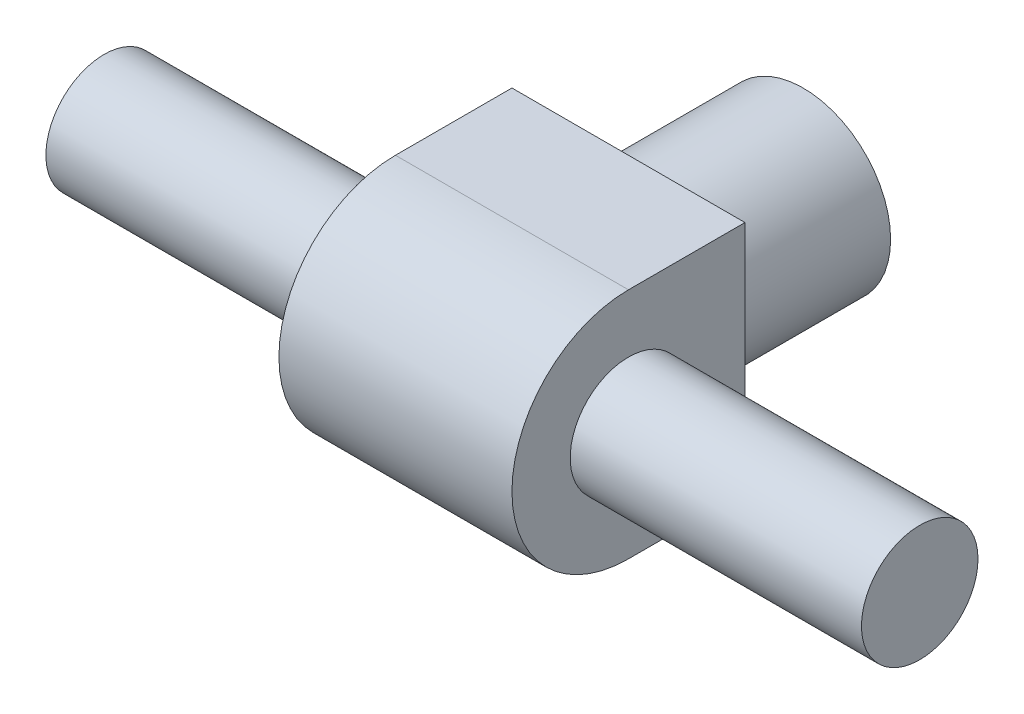
ISO-10303-21;
HEADER;
FILE_DESCRIPTION(('STEP AP214'),'2;1');
FILE_NAME('part.step','',(''),(''),'','','');
FILE_SCHEMA(('AUTOMOTIVE_DESIGN { 1 0 10303 214 1 1 1 1 }'));
ENDSEC;
DATA;
#1=APPLICATION_CONTEXT('core data for automotive mechanical design processes');
#2=APPLICATION_PROTOCOL_DEFINITION('international standard','automotive_design',2000,#1);
#3=PRODUCT_CONTEXT('',#1,'mechanical');
#4=PRODUCT('Part','Part','',(#3));
#5=PRODUCT_RELATED_PRODUCT_CATEGORY('part','',(#4));
#6=PRODUCT_DEFINITION_FORMATION('','',#4);
#7=PRODUCT_DEFINITION_CONTEXT('part definition',#1,'design');
#8=PRODUCT_DEFINITION('design','',#6,#7);
#9=PRODUCT_DEFINITION_SHAPE('','',#8);
#10=(LENGTH_UNIT() NAMED_UNIT(*) SI_UNIT(.MILLI.,.METRE.));
#11=(NAMED_UNIT(*) PLANE_ANGLE_UNIT() SI_UNIT($,.RADIAN.));
#12=(NAMED_UNIT(*) SI_UNIT($,.STERADIAN.) SOLID_ANGLE_UNIT());
#13=UNCERTAINTY_MEASURE_WITH_UNIT(LENGTH_MEASURE(1.E-05),#10,'distance_accuracy_value','');
#14=(GEOMETRIC_REPRESENTATION_CONTEXT(3) GLOBAL_UNCERTAINTY_ASSIGNED_CONTEXT((#13)) GLOBAL_UNIT_ASSIGNED_CONTEXT((#10,
#11,#12)) REPRESENTATION_CONTEXT('',''));
#15=CARTESIAN_POINT('',(0.,0.,0.));
#16=DIRECTION('',(0.,0.,1.));
#17=DIRECTION('',(1.,0.,0.));
#18=AXIS2_PLACEMENT_3D('',#15,#16,#17);
#19=CARTESIAN_POINT('',(0.,0.,15.));
#20=DIRECTION('',(0.,0.,-1.));
#21=DIRECTION('',(-1.,0.,0.));
#22=AXIS2_PLACEMENT_3D('',#19,#20,#21);
#23=CYLINDRICAL_SURFACE('',#22,7.5);
#24=CARTESIAN_POINT('',(0.,0.,15.));
#25=DIRECTION('',(0.,0.,1.));
#26=DIRECTION('',(1.,0.,0.));
#27=AXIS2_PLACEMENT_3D('',#24,#25,#26);
#28=CIRCLE('',#27,7.5);
#29=CARTESIAN_POINT('',(7.5,0.,15.));
#30=VERTEX_POINT('',#29);
#31=EDGE_CURVE('E43',#30,#30,#28,.T.);
#32=ORIENTED_EDGE('',*,*,#31,.F.);
#33=EDGE_LOOP('',(#32));
#34=FACE_BOUND('',#33,.T.);
#35=CARTESIAN_POINT('',(0.,0.,0.));
#36=DIRECTION('',(0.,0.,1.));
#37=DIRECTION('',(1.,0.,0.));
#38=AXIS2_PLACEMENT_3D('',#35,#36,#37);
#39=CIRCLE('',#38,7.5);
#40=CARTESIAN_POINT('',(7.5,0.,0.));
#41=VERTEX_POINT('',#40);
#42=EDGE_CURVE('E114',#41,#41,#39,.T.);
#43=ORIENTED_EDGE('',*,*,#42,.T.);
#44=EDGE_LOOP('',(#43));
#45=FACE_BOUND('',#44,.T.);
#46=ADVANCED_FACE('F36',(#34,#45),#23,.T.);
#47=CARTESIAN_POINT('',(0.,0.,0.));
#48=DIRECTION('',(0.,0.,1.));
#49=DIRECTION('',(1.,0.,0.));
#50=AXIS2_PLACEMENT_3D('',#47,#48,#49);
#51=PLANE('',#50);
#52=ORIENTED_EDGE('',*,*,#42,.F.);
#53=EDGE_LOOP('',(#52));
#54=FACE_BOUND('',#53,.T.);
#55=ADVANCED_FACE('F122',(#54),#51,.F.);
#56=CARTESIAN_POINT('',(-10.,0.,25.));
#57=DIRECTION('',(1.,0.,0.));
#58=DIRECTION('',(0.,0.,-1.));
#59=AXIS2_PLACEMENT_3D('',#56,#57,#58);
#60=CYLINDRICAL_SURFACE('',#59,10.);
#61=DIRECTION('',(1.,0.,0.));
#62=VECTOR('',#61,1.);
#63=CARTESIAN_POINT('',(-10.,-10.,25.));
#64=LINE('',#63,#62);
#65=CARTESIAN_POINT('',(-10.,-10.,25.));
#66=VERTEX_POINT('',#65);
#67=CARTESIAN_POINT('',(10.,-10.,25.));
#68=VERTEX_POINT('',#67);
#69=EDGE_CURVE('E75',#66,#68,#64,.T.);
#70=ORIENTED_EDGE('',*,*,#69,.T.);
#71=CARTESIAN_POINT('',(10.,0.,25.));
#72=DIRECTION('',(1.,0.,0.));
#73=DIRECTION('',(0.,0.,-1.));
#74=AXIS2_PLACEMENT_3D('',#71,#72,#73);
#75=CIRCLE('',#74,10.);
#76=CARTESIAN_POINT('',(10.,10.,25.));
#77=VERTEX_POINT('',#76);
#78=EDGE_CURVE('E79',#77,#68,#75,.T.);
#79=ORIENTED_EDGE('',*,*,#78,.F.);
#80=DIRECTION('',(1.,0.,0.));
#81=VECTOR('',#80,1.);
#82=CARTESIAN_POINT('',(-10.,10.,25.));
#83=LINE('',#82,#81);
#84=CARTESIAN_POINT('',(-10.,10.,25.));
#85=VERTEX_POINT('',#84);
#86=EDGE_CURVE('E50',#85,#77,#83,.T.);
#87=ORIENTED_EDGE('',*,*,#86,.F.);
#88=CARTESIAN_POINT('',(-10.,0.,25.));
#89=DIRECTION('',(1.,0.,0.));
#90=DIRECTION('',(0.,0.,-1.));
#91=AXIS2_PLACEMENT_3D('',#88,#89,#90);
#92=CIRCLE('',#91,10.);
#93=EDGE_CURVE('E80',#85,#66,#92,.T.);
#94=ORIENTED_EDGE('',*,*,#93,.T.);
#95=EDGE_LOOP('',(#70,#79,#87,#94));
#96=FACE_BOUND('',#95,.T.);
#97=ADVANCED_FACE('F77',(#96),#60,.T.);
#98=CARTESIAN_POINT('',(-10.,10.,15.));
#99=DIRECTION('',(0.,1.,0.));
#100=DIRECTION('',(0.,0.,1.));
#101=AXIS2_PLACEMENT_3D('',#98,#99,#100);
#102=PLANE('',#101);
#103=ORIENTED_EDGE('',*,*,#86,.T.);
#104=DIRECTION('',(0.,0.,1.));
#105=VECTOR('',#104,1.);
#106=CARTESIAN_POINT('',(10.,10.,15.));
#107=LINE('',#106,#105);
#108=CARTESIAN_POINT('',(10.,10.,15.));
#109=VERTEX_POINT('',#108);
#110=EDGE_CURVE('E97',#109,#77,#107,.T.);
#111=ORIENTED_EDGE('',*,*,#110,.F.);
#112=DIRECTION('',(1.,0.,0.));
#113=VECTOR('',#112,1.);
#114=CARTESIAN_POINT('',(-10.,10.,15.));
#115=LINE('',#114,#113);
#116=CARTESIAN_POINT('',(-10.,10.,15.));
#117=VERTEX_POINT('',#116);
#118=EDGE_CURVE('E58',#117,#109,#115,.T.);
#119=ORIENTED_EDGE('',*,*,#118,.F.);
#120=DIRECTION('',(0.,0.,1.));
#121=VECTOR('',#120,1.);
#122=CARTESIAN_POINT('',(-10.,10.,15.));
#123=LINE('',#122,#121);
#124=EDGE_CURVE('E85',#117,#85,#123,.T.);
#125=ORIENTED_EDGE('',*,*,#124,.T.);
#126=EDGE_LOOP('',(#103,#111,#119,#125));
#127=FACE_BOUND('',#126,.T.);
#128=ADVANCED_FACE('F128',(#127),#102,.T.);
#129=CARTESIAN_POINT('',(-10.,-10.,15.));
#130=DIRECTION('',(0.,0.,-1.));
#131=DIRECTION('',(0.,1.,0.));
#132=AXIS2_PLACEMENT_3D('',#129,#130,#131);
#133=PLANE('',#132);
#134=ORIENTED_EDGE('',*,*,#31,.T.);
#135=EDGE_LOOP('',(#134));
#136=FACE_BOUND('',#135,.T.);
#137=ORIENTED_EDGE('',*,*,#118,.T.);
#138=DIRECTION('',(0.,1.,0.));
#139=VECTOR('',#138,1.);
#140=CARTESIAN_POINT('',(10.,-10.,15.));
#141=LINE('',#140,#139);
#142=CARTESIAN_POINT('',(10.,-10.,15.));
#143=VERTEX_POINT('',#142);
#144=EDGE_CURVE('E93',#143,#109,#141,.T.);
#145=ORIENTED_EDGE('',*,*,#144,.F.);
#146=DIRECTION('',(1.,0.,0.));
#147=VECTOR('',#146,1.);
#148=CARTESIAN_POINT('',(-10.,-10.,15.));
#149=LINE('',#148,#147);
#150=CARTESIAN_POINT('',(-10.,-10.,15.));
#151=VERTEX_POINT('',#150);
#152=EDGE_CURVE('E84',#151,#143,#149,.T.);
#153=ORIENTED_EDGE('',*,*,#152,.F.);
#154=DIRECTION('',(0.,1.,0.));
#155=VECTOR('',#154,1.);
#156=CARTESIAN_POINT('',(-10.,-10.,15.));
#157=LINE('',#156,#155);
#158=EDGE_CURVE('E110',#151,#117,#157,.T.);
#159=ORIENTED_EDGE('',*,*,#158,.T.);
#160=EDGE_LOOP('',(#137,#145,#153,#159));
#161=FACE_BOUND('',#160,.T.);
#162=ADVANCED_FACE('F135',(#136,#161),#133,.T.);
#163=CARTESIAN_POINT('',(-10.,-10.,25.));
#164=DIRECTION('',(0.,-1.,0.));
#165=DIRECTION('',(0.,0.,-1.));
#166=AXIS2_PLACEMENT_3D('',#163,#164,#165);
#167=PLANE('',#166);
#168=ORIENTED_EDGE('',*,*,#152,.T.);
#169=DIRECTION('',(0.,0.,-1.));
#170=VECTOR('',#169,1.);
#171=CARTESIAN_POINT('',(10.,-10.,25.));
#172=LINE('',#171,#170);
#173=EDGE_CURVE('E88',#68,#143,#172,.T.);
#174=ORIENTED_EDGE('',*,*,#173,.F.);
#175=ORIENTED_EDGE('',*,*,#69,.F.);
#176=DIRECTION('',(0.,0.,-1.));
#177=VECTOR('',#176,1.);
#178=CARTESIAN_POINT('',(-10.,-10.,25.));
#179=LINE('',#178,#177);
#180=EDGE_CURVE('E108',#66,#151,#179,.T.);
#181=ORIENTED_EDGE('',*,*,#180,.T.);
#182=EDGE_LOOP('',(#168,#174,#175,#181));
#183=FACE_BOUND('',#182,.T.);
#184=ADVANCED_FACE('F89',(#183),#167,.T.);
#185=CARTESIAN_POINT('',(-10.,0.,25.));
#186=DIRECTION('',(1.,0.,0.));
#187=DIRECTION('',(0.,0.,-1.));
#188=AXIS2_PLACEMENT_3D('',#185,#186,#187);
#189=PLANE('',#188);
#190=CARTESIAN_POINT('',(-10.,0.,25.));
#191=DIRECTION('',(1.,0.,0.));
#192=DIRECTION('',(0.,0.,-1.));
#193=AXIS2_PLACEMENT_3D('',#190,#191,#192);
#194=CIRCLE('',#193,5.);
#195=CARTESIAN_POINT('',(-10.,0.,20.));
#196=VERTEX_POINT('',#195);
#197=EDGE_CURVE('E98',#196,#196,#194,.T.);
#198=ORIENTED_EDGE('',*,*,#197,.T.);
#199=EDGE_LOOP('',(#198));
#200=FACE_BOUND('',#199,.T.);
#201=ORIENTED_EDGE('',*,*,#93,.F.);
#202=ORIENTED_EDGE('',*,*,#124,.F.);
#203=ORIENTED_EDGE('',*,*,#158,.F.);
#204=ORIENTED_EDGE('',*,*,#180,.F.);
#205=EDGE_LOOP('',(#201,#202,#203,#204));
#206=FACE_BOUND('',#205,.T.);
#207=ADVANCED_FACE('F134',(#200,#206),#189,.F.);
#208=CARTESIAN_POINT('',(10.,0.,25.));
#209=DIRECTION('',(1.,0.,0.));
#210=DIRECTION('',(0.,0.,-1.));
#211=AXIS2_PLACEMENT_3D('',#208,#209,#210);
#212=PLANE('',#211);
#213=CARTESIAN_POINT('',(10.,0.,25.));
#214=DIRECTION('',(1.,0.,0.));
#215=DIRECTION('',(0.,0.,-1.));
#216=AXIS2_PLACEMENT_3D('',#213,#214,#215);
#217=CIRCLE('',#216,5.);
#218=CARTESIAN_POINT('',(10.,0.,20.));
#219=VERTEX_POINT('',#218);
#220=EDGE_CURVE('E11',#219,#219,#217,.T.);
#221=ORIENTED_EDGE('',*,*,#220,.F.);
#222=EDGE_LOOP('',(#221));
#223=FACE_BOUND('',#222,.T.);
#224=ORIENTED_EDGE('',*,*,#78,.T.);
#225=ORIENTED_EDGE('',*,*,#173,.T.);
#226=ORIENTED_EDGE('',*,*,#144,.T.);
#227=ORIENTED_EDGE('',*,*,#110,.T.);
#228=EDGE_LOOP('',(#224,#225,#226,#227));
#229=FACE_BOUND('',#228,.T.);
#230=ADVANCED_FACE('F96',(#223,#229),#212,.T.);
#231=CARTESIAN_POINT('',(35.,0.,25.));
#232=DIRECTION('',(1.,0.,0.));
#233=DIRECTION('',(0.,0.,-1.));
#234=AXIS2_PLACEMENT_3D('',#231,#232,#233);
#235=PLANE('',#234);
#236=CARTESIAN_POINT('',(35.,0.,25.));
#237=DIRECTION('',(1.,0.,0.));
#238=DIRECTION('',(0.,0.,-1.));
#239=AXIS2_PLACEMENT_3D('',#236,#237,#238);
#240=CIRCLE('',#239,5.);
#241=CARTESIAN_POINT('',(35.,0.,20.));
#242=VERTEX_POINT('',#241);
#243=EDGE_CURVE('E163',#242,#242,#240,.T.);
#244=ORIENTED_EDGE('',*,*,#243,.T.);
#245=EDGE_LOOP('',(#244));
#246=FACE_BOUND('',#245,.T.);
#247=ADVANCED_FACE('F146',(#246),#235,.T.);
#248=CARTESIAN_POINT('',(-35.,0.,25.));
#249=DIRECTION('',(1.,0.,0.));
#250=DIRECTION('',(0.,0.,-1.));
#251=AXIS2_PLACEMENT_3D('',#248,#249,#250);
#252=CYLINDRICAL_SURFACE('',#251,5.);
#253=ORIENTED_EDGE('',*,*,#220,.T.);
#254=EDGE_LOOP('',(#253));
#255=FACE_BOUND('',#254,.T.);
#256=ORIENTED_EDGE('',*,*,#243,.F.);
#257=EDGE_LOOP('',(#256));
#258=FACE_BOUND('',#257,.T.);
#259=ADVANCED_FACE('F148',(#255,#258),#252,.T.);
#260=CARTESIAN_POINT('',(-35.,0.,25.));
#261=DIRECTION('',(1.,0.,0.));
#262=DIRECTION('',(0.,0.,-1.));
#263=AXIS2_PLACEMENT_3D('',#260,#261,#262);
#264=CIRCLE('',#263,5.);
#265=CARTESIAN_POINT('',(-35.,0.,20.));
#266=VERTEX_POINT('',#265);
#267=EDGE_CURVE('E101',#266,#266,#264,.T.);
#268=ORIENTED_EDGE('',*,*,#267,.T.);
#269=EDGE_LOOP('',(#268));
#270=FACE_BOUND('',#269,.T.);
#271=ORIENTED_EDGE('',*,*,#197,.F.);
#272=EDGE_LOOP('',(#271));
#273=FACE_BOUND('',#272,.T.);
#274=ADVANCED_FACE('F151',(#270,#273),#252,.T.);
#275=CARTESIAN_POINT('',(-35.,0.,25.));
#276=DIRECTION('',(1.,0.,0.));
#277=DIRECTION('',(0.,0.,-1.));
#278=AXIS2_PLACEMENT_3D('',#275,#276,#277);
#279=PLANE('',#278);
#280=ORIENTED_EDGE('',*,*,#267,.F.);
#281=EDGE_LOOP('',(#280));
#282=FACE_BOUND('',#281,.T.);
#283=ADVANCED_FACE('F153',(#282),#279,.F.);
#284=CLOSED_SHELL('',(#46,#55,#97,#128,#162,#184,#207,#230,#247,#259,#274,#283));
#285=MANIFOLD_SOLID_BREP('B2',#284);
#286=ADVANCED_BREP_SHAPE_REPRESENTATION('',(#18,#285),#14);
#287=SHAPE_DEFINITION_REPRESENTATION(#9,#286);
ENDSEC;
END-ISO-10303-21;
